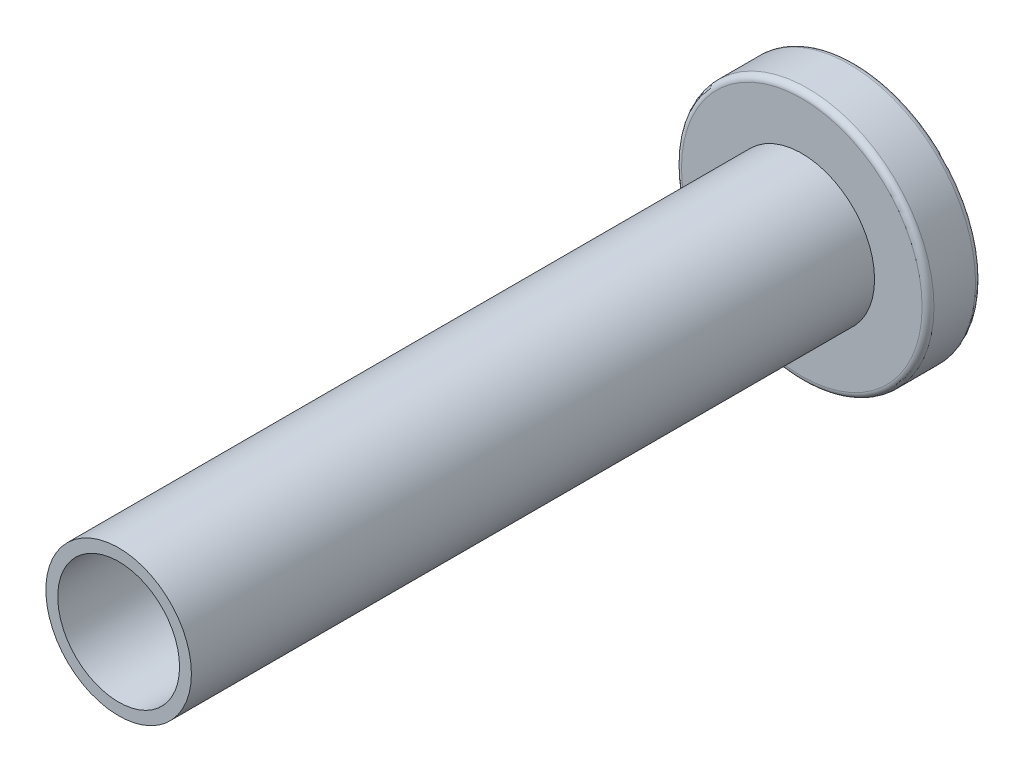
ISO-10303-21;
HEADER;
FILE_DESCRIPTION(('STEP AP214'),'2;1');
FILE_NAME('part.step','',(''),(''),'','','');
FILE_SCHEMA(('AUTOMOTIVE_DESIGN { 1 0 10303 214 1 1 1 1 }'));
ENDSEC;
DATA;
#1=APPLICATION_CONTEXT('core data for automotive mechanical design processes');
#2=APPLICATION_PROTOCOL_DEFINITION('international standard','automotive_design',2000,#1);
#3=PRODUCT_CONTEXT('',#1,'mechanical');
#4=PRODUCT('Part','Part','',(#3));
#5=PRODUCT_RELATED_PRODUCT_CATEGORY('part','',(#4));
#6=PRODUCT_DEFINITION_FORMATION('','',#4);
#7=PRODUCT_DEFINITION_CONTEXT('part definition',#1,'design');
#8=PRODUCT_DEFINITION('design','',#6,#7);
#9=PRODUCT_DEFINITION_SHAPE('','',#8);
#10=(LENGTH_UNIT() NAMED_UNIT(*) SI_UNIT(.MILLI.,.METRE.));
#11=(NAMED_UNIT(*) PLANE_ANGLE_UNIT() SI_UNIT($,.RADIAN.));
#12=(NAMED_UNIT(*) SI_UNIT($,.STERADIAN.) SOLID_ANGLE_UNIT());
#13=UNCERTAINTY_MEASURE_WITH_UNIT(LENGTH_MEASURE(1.E-05),#10,'distance_accuracy_value','');
#14=(GEOMETRIC_REPRESENTATION_CONTEXT(3) GLOBAL_UNCERTAINTY_ASSIGNED_CONTEXT((#13)) GLOBAL_UNIT_ASSIGNED_CONTEXT((#10,
#11,#12)) REPRESENTATION_CONTEXT('',''));
#15=CARTESIAN_POINT('',(0.,0.,0.));
#16=DIRECTION('',(0.,0.,1.));
#17=DIRECTION('',(1.,0.,0.));
#18=AXIS2_PLACEMENT_3D('',#15,#16,#17);
#19=CARTESIAN_POINT('',(0.,0.,1.8));
#20=DIRECTION('',(0.,0.,-1.));
#21=DIRECTION('',(-1.,0.,0.));
#22=AXIS2_PLACEMENT_3D('',#19,#20,#21);
#23=CYLINDRICAL_SURFACE('',#22,4.25);
#24=CARTESIAN_POINT('',(0.,0.,0.2));
#25=DIRECTION('',(0.,0.,1.));
#26=DIRECTION('',(1.,0.,0.));
#27=AXIS2_PLACEMENT_3D('',#24,#25,#26);
#28=CIRCLE('',#27,4.25);
#29=CARTESIAN_POINT('',(4.25,0.,0.2));
#30=VERTEX_POINT('',#29);
#31=EDGE_CURVE('E167',#30,#30,#28,.T.);
#32=ORIENTED_EDGE('',*,*,#31,.T.);
#33=EDGE_LOOP('',(#32));
#34=FACE_BOUND('',#33,.T.);
#35=CARTESIAN_POINT('',(0.,0.,1.6));
#36=DIRECTION('',(0.,0.,1.));
#37=DIRECTION('',(1.,0.,0.));
#38=AXIS2_PLACEMENT_3D('',#35,#36,#37);
#39=CIRCLE('',#38,4.25);
#40=CARTESIAN_POINT('',(4.25,0.,1.6));
#41=VERTEX_POINT('',#40);
#42=EDGE_CURVE('E164',#41,#41,#39,.F.);
#43=ORIENTED_EDGE('',*,*,#42,.T.);
#44=EDGE_LOOP('',(#43));
#45=FACE_BOUND('',#44,.T.);
#46=ADVANCED_FACE('F45',(#34,#45),#23,.T.);
#47=CARTESIAN_POINT('',(0.,0.,1.8));
#48=DIRECTION('',(0.,0.,1.));
#49=DIRECTION('',(1.,0.,0.));
#50=AXIS2_PLACEMENT_3D('',#47,#48,#49);
#51=PLANE('',#50);
#52=CARTESIAN_POINT('',(0.,0.,1.8));
#53=DIRECTION('',(0.,0.,1.));
#54=DIRECTION('',(1.,0.,0.));
#55=AXIS2_PLACEMENT_3D('',#52,#53,#54);
#56=CIRCLE('',#55,4.05);
#57=CARTESIAN_POINT('',(4.05,0.,1.8));
#58=VERTEX_POINT('',#57);
#59=EDGE_CURVE('E11',#58,#58,#56,.T.);
#60=ORIENTED_EDGE('',*,*,#59,.T.);
#61=EDGE_LOOP('',(#60));
#62=FACE_BOUND('',#61,.T.);
#63=CARTESIAN_POINT('',(0.,0.,1.8));
#64=DIRECTION('',(0.,0.,1.));
#65=DIRECTION('',(1.,0.,0.));
#66=AXIS2_PLACEMENT_3D('',#63,#64,#65);
#67=CIRCLE('',#66,2.45);
#68=CARTESIAN_POINT('',(2.45,0.,1.8));
#69=VERTEX_POINT('',#68);
#70=EDGE_CURVE('E155',#69,#69,#67,.T.);
#71=ORIENTED_EDGE('',*,*,#70,.F.);
#72=EDGE_LOOP('',(#71));
#73=FACE_BOUND('',#72,.T.);
#74=ADVANCED_FACE('F182',(#62,#73),#51,.T.);
#75=CARTESIAN_POINT('',(0.,0.,0.));
#76=DIRECTION('',(0.,0.,1.));
#77=DIRECTION('',(1.,0.,0.));
#78=AXIS2_PLACEMENT_3D('',#75,#76,#77);
#79=PLANE('',#78);
#80=DIRECTION('',(0.5,0.866025403784438,0.));
#81=VECTOR('',#80,1.);
#82=CARTESIAN_POINT('',(-1.44337567297407,0.,0.));
#83=LINE('',#82,#81);
#84=CARTESIAN_POINT('',(-1.44337567297407,0.,0.));
#85=VERTEX_POINT('',#84);
#86=CARTESIAN_POINT('',(-0.721687836487032,1.25,0.));
#87=VERTEX_POINT('',#86);
#88=EDGE_CURVE('E134',#85,#87,#83,.T.);
#89=ORIENTED_EDGE('',*,*,#88,.F.);
#90=DIRECTION('',(-0.5,0.866025403784438,0.));
#91=VECTOR('',#90,1.);
#92=CARTESIAN_POINT('',(-0.721687836487033,-1.25,0.));
#93=LINE('',#92,#91);
#94=CARTESIAN_POINT('',(-0.721687836487033,-1.25,0.));
#95=VERTEX_POINT('',#94);
#96=EDGE_CURVE('E60',#95,#85,#93,.T.);
#97=ORIENTED_EDGE('',*,*,#96,.F.);
#98=DIRECTION('',(-1.,0.,0.));
#99=VECTOR('',#98,1.);
#100=CARTESIAN_POINT('',(0.721687836487032,-1.25,0.));
#101=LINE('',#100,#99);
#102=CARTESIAN_POINT('',(0.721687836487032,-1.25,0.));
#103=VERTEX_POINT('',#102);
#104=EDGE_CURVE('E143',#103,#95,#101,.T.);
#105=ORIENTED_EDGE('',*,*,#104,.F.);
#106=DIRECTION('',(-0.5,-0.866025403784438,0.));
#107=VECTOR('',#106,1.);
#108=CARTESIAN_POINT('',(1.44337567297406,0.,0.));
#109=LINE('',#108,#107);
#110=CARTESIAN_POINT('',(1.44337567297406,0.,0.));
#111=VERTEX_POINT('',#110);
#112=EDGE_CURVE('E141',#111,#103,#109,.T.);
#113=ORIENTED_EDGE('',*,*,#112,.F.);
#114=DIRECTION('',(0.5,-0.866025403784438,0.));
#115=VECTOR('',#114,1.);
#116=CARTESIAN_POINT('',(0.721687836487032,1.25,0.));
#117=LINE('',#116,#115);
#118=CARTESIAN_POINT('',(0.721687836487032,1.25,0.));
#119=VERTEX_POINT('',#118);
#120=EDGE_CURVE('E108',#119,#111,#117,.T.);
#121=ORIENTED_EDGE('',*,*,#120,.F.);
#122=DIRECTION('',(1.,0.,0.));
#123=VECTOR('',#122,1.);
#124=CARTESIAN_POINT('',(-0.721687836487032,1.25,0.));
#125=LINE('',#124,#123);
#126=EDGE_CURVE('E137',#87,#119,#125,.T.);
#127=ORIENTED_EDGE('',*,*,#126,.F.);
#128=EDGE_LOOP('',(#89,#97,#105,#113,#121,#127));
#129=FACE_BOUND('',#128,.T.);
#130=CARTESIAN_POINT('',(0.,0.,0.));
#131=DIRECTION('',(0.,0.,1.));
#132=DIRECTION('',(1.,0.,0.));
#133=AXIS2_PLACEMENT_3D('',#130,#131,#132);
#134=CIRCLE('',#133,4.05);
#135=CARTESIAN_POINT('',(4.05,0.,0.));
#136=VERTEX_POINT('',#135);
#137=EDGE_CURVE('E53',#136,#136,#134,.F.);
#138=ORIENTED_EDGE('',*,*,#137,.T.);
#139=EDGE_LOOP('',(#138));
#140=FACE_BOUND('',#139,.T.);
#141=ADVANCED_FACE('F172',(#129,#140),#79,.F.);
#142=CARTESIAN_POINT('',(0.,0.,24.8));
#143=DIRECTION('',(0.,0.,1.));
#144=DIRECTION('',(1.,0.,0.));
#145=AXIS2_PLACEMENT_3D('',#142,#143,#144);
#146=PLANE('',#145);
#147=CARTESIAN_POINT('',(0.,0.,24.8));
#148=DIRECTION('',(0.,0.,1.));
#149=DIRECTION('',(1.,0.,0.));
#150=AXIS2_PLACEMENT_3D('',#147,#148,#149);
#151=CIRCLE('',#150,2.45);
#152=CARTESIAN_POINT('',(2.45,0.,24.8));
#153=VERTEX_POINT('',#152);
#154=EDGE_CURVE('E156',#153,#153,#151,.T.);
#155=ORIENTED_EDGE('',*,*,#154,.T.);
#156=EDGE_LOOP('',(#155));
#157=FACE_BOUND('',#156,.T.);
#158=CARTESIAN_POINT('',(0.,0.,24.8));
#159=DIRECTION('',(0.,0.,1.));
#160=DIRECTION('',(1.,0.,0.));
#161=AXIS2_PLACEMENT_3D('',#158,#159,#160);
#162=CIRCLE('',#161,2.05);
#163=CARTESIAN_POINT('',(2.05,0.,24.8));
#164=VERTEX_POINT('',#163);
#165=EDGE_CURVE('E147',#164,#164,#162,.T.);
#166=ORIENTED_EDGE('',*,*,#165,.F.);
#167=EDGE_LOOP('',(#166));
#168=FACE_BOUND('',#167,.T.);
#169=ADVANCED_FACE('F199',(#157,#168),#146,.T.);
#170=CARTESIAN_POINT('',(0.,0.,24.8));
#171=DIRECTION('',(0.,0.,-1.));
#172=DIRECTION('',(-1.,0.,0.));
#173=AXIS2_PLACEMENT_3D('',#170,#171,#172);
#174=CYLINDRICAL_SURFACE('',#173,2.45);
#175=ORIENTED_EDGE('',*,*,#154,.F.);
#176=EDGE_LOOP('',(#175));
#177=FACE_BOUND('',#176,.T.);
#178=ORIENTED_EDGE('',*,*,#70,.T.);
#179=EDGE_LOOP('',(#178));
#180=FACE_BOUND('',#179,.T.);
#181=ADVANCED_FACE('F196',(#177,#180),#174,.T.);
#182=CARTESIAN_POINT('',(0.,0.,24.8));
#183=DIRECTION('',(0.,0.,-1.));
#184=DIRECTION('',(-1.,0.,0.));
#185=AXIS2_PLACEMENT_3D('',#182,#183,#184);
#186=CYLINDRICAL_SURFACE('',#185,2.05);
#187=ORIENTED_EDGE('',*,*,#165,.T.);
#188=EDGE_LOOP('',(#187));
#189=FACE_BOUND('',#188,.T.);
#190=CARTESIAN_POINT('',(0.,0.,1.8));
#191=DIRECTION('',(0.,0.,1.));
#192=DIRECTION('',(1.,0.,0.));
#193=AXIS2_PLACEMENT_3D('',#190,#191,#192);
#194=CIRCLE('',#193,2.05);
#195=CARTESIAN_POINT('',(2.05,0.,1.8));
#196=VERTEX_POINT('',#195);
#197=EDGE_CURVE('E159',#196,#196,#194,.F.);
#198=ORIENTED_EDGE('',*,*,#197,.T.);
#199=EDGE_LOOP('',(#198));
#200=FACE_BOUND('',#199,.T.);
#201=ADVANCED_FACE('F198',(#189,#200),#186,.F.);
#202=ORIENTED_EDGE('',*,*,#197,.F.);
#203=EDGE_LOOP('',(#202));
#204=FACE_BOUND('',#203,.T.);
#205=ADVANCED_FACE('F177',(#204),#51,.T.);
#206=CARTESIAN_POINT('',(0.,0.,0.2));
#207=DIRECTION('',(0.,0.,1.));
#208=DIRECTION('',(1.,0.,0.));
#209=AXIS2_PLACEMENT_3D('',#206,#207,#208);
#210=TOROIDAL_SURFACE('',#209,4.05,0.2);
#211=ORIENTED_EDGE('',*,*,#137,.F.);
#212=EDGE_LOOP('',(#211));
#213=FACE_BOUND('',#212,.T.);
#214=ORIENTED_EDGE('',*,*,#31,.F.);
#215=EDGE_LOOP('',(#214));
#216=FACE_BOUND('',#215,.T.);
#217=ADVANCED_FACE('F174',(#213,#216),#210,.T.);
#218=CARTESIAN_POINT('',(0.,0.,1.6));
#219=DIRECTION('',(0.,0.,1.));
#220=DIRECTION('',(1.,0.,0.));
#221=AXIS2_PLACEMENT_3D('',#218,#219,#220);
#222=TOROIDAL_SURFACE('',#221,4.05,0.2);
#223=ORIENTED_EDGE('',*,*,#42,.F.);
#224=EDGE_LOOP('',(#223));
#225=FACE_BOUND('',#224,.T.);
#226=ORIENTED_EDGE('',*,*,#59,.F.);
#227=EDGE_LOOP('',(#226));
#228=FACE_BOUND('',#227,.T.);
#229=ADVANCED_FACE('F47',(#225,#228),#222,.T.);
#230=CARTESIAN_POINT('',(-0.721687836487033,-1.25,1.));
#231=DIRECTION('',(-0.866025403784439,-0.5,0.));
#232=DIRECTION('',(0.5,-0.866025403784439,0.));
#233=AXIS2_PLACEMENT_3D('',#230,#231,#232);
#234=PLANE('',#233);
#235=ORIENTED_EDGE('',*,*,#96,.T.);
#236=DIRECTION('',(0.,0.,-1.));
#237=VECTOR('',#236,1.);
#238=CARTESIAN_POINT('',(-1.44337567297407,0.,1.));
#239=LINE('',#238,#237);
#240=CARTESIAN_POINT('',(-1.44337567297407,0.,1.));
#241=VERTEX_POINT('',#240);
#242=EDGE_CURVE('E90',#241,#85,#239,.T.);
#243=ORIENTED_EDGE('',*,*,#242,.F.);
#244=DIRECTION('',(-0.5,0.866025403784438,0.));
#245=VECTOR('',#244,1.);
#246=CARTESIAN_POINT('',(-0.721687836487033,-1.25,1.));
#247=LINE('',#246,#245);
#248=CARTESIAN_POINT('',(-0.721687836487033,-1.25,1.));
#249=VERTEX_POINT('',#248);
#250=EDGE_CURVE('E145',#249,#241,#247,.T.);
#251=ORIENTED_EDGE('',*,*,#250,.F.);
#252=DIRECTION('',(0.,0.,-1.));
#253=VECTOR('',#252,1.);
#254=CARTESIAN_POINT('',(-0.721687836487033,-1.25,1.));
#255=LINE('',#254,#253);
#256=EDGE_CURVE('E68',#249,#95,#255,.T.);
#257=ORIENTED_EDGE('',*,*,#256,.T.);
#258=EDGE_LOOP('',(#235,#243,#251,#257));
#259=FACE_BOUND('',#258,.T.);
#260=ADVANCED_FACE('F188',(#259),#234,.F.);
#261=CARTESIAN_POINT('',(0.721687836487032,-1.25,1.));
#262=DIRECTION('',(0.,-1.,0.));
#263=DIRECTION('',(1.,0.,0.));
#264=AXIS2_PLACEMENT_3D('',#261,#262,#263);
#265=PLANE('',#264);
#266=ORIENTED_EDGE('',*,*,#104,.T.);
#267=ORIENTED_EDGE('',*,*,#256,.F.);
#268=DIRECTION('',(-1.,0.,0.));
#269=VECTOR('',#268,1.);
#270=CARTESIAN_POINT('',(0.721687836487032,-1.25,1.));
#271=LINE('',#270,#269);
#272=CARTESIAN_POINT('',(0.721687836487032,-1.25,1.));
#273=VERTEX_POINT('',#272);
#274=EDGE_CURVE('E120',#273,#249,#271,.T.);
#275=ORIENTED_EDGE('',*,*,#274,.F.);
#276=DIRECTION('',(0.,0.,-1.));
#277=VECTOR('',#276,1.);
#278=CARTESIAN_POINT('',(0.721687836487032,-1.25,1.));
#279=LINE('',#278,#277);
#280=EDGE_CURVE('E112',#273,#103,#279,.T.);
#281=ORIENTED_EDGE('',*,*,#280,.T.);
#282=EDGE_LOOP('',(#266,#267,#275,#281));
#283=FACE_BOUND('',#282,.T.);
#284=ADVANCED_FACE('F223',(#283),#265,.F.);
#285=CARTESIAN_POINT('',(1.44337567297406,0.,1.));
#286=DIRECTION('',(0.866025403784438,-0.5,0.));
#287=DIRECTION('',(0.5,0.866025403784439,0.));
#288=AXIS2_PLACEMENT_3D('',#285,#286,#287);
#289=PLANE('',#288);
#290=ORIENTED_EDGE('',*,*,#112,.T.);
#291=ORIENTED_EDGE('',*,*,#280,.F.);
#292=DIRECTION('',(-0.5,-0.866025403784438,0.));
#293=VECTOR('',#292,1.);
#294=CARTESIAN_POINT('',(1.44337567297406,0.,1.));
#295=LINE('',#294,#293);
#296=CARTESIAN_POINT('',(1.44337567297406,0.,1.));
#297=VERTEX_POINT('',#296);
#298=EDGE_CURVE('E116',#297,#273,#295,.T.);
#299=ORIENTED_EDGE('',*,*,#298,.F.);
#300=DIRECTION('',(0.,0.,-1.));
#301=VECTOR('',#300,1.);
#302=CARTESIAN_POINT('',(1.44337567297406,0.,1.));
#303=LINE('',#302,#301);
#304=EDGE_CURVE('E101',#297,#111,#303,.T.);
#305=ORIENTED_EDGE('',*,*,#304,.T.);
#306=EDGE_LOOP('',(#290,#291,#299,#305));
#307=FACE_BOUND('',#306,.T.);
#308=ADVANCED_FACE('F117',(#307),#289,.F.);
#309=CARTESIAN_POINT('',(0.721687836487032,1.25,1.));
#310=DIRECTION('',(0.866025403784439,0.5,0.));
#311=DIRECTION('',(-0.5,0.866025403784438,0.));
#312=AXIS2_PLACEMENT_3D('',#309,#310,#311);
#313=PLANE('',#312);
#314=ORIENTED_EDGE('',*,*,#120,.T.);
#315=ORIENTED_EDGE('',*,*,#304,.F.);
#316=DIRECTION('',(0.5,-0.866025403784438,0.));
#317=VECTOR('',#316,1.);
#318=CARTESIAN_POINT('',(0.721687836487032,1.25,1.));
#319=LINE('',#318,#317);
#320=CARTESIAN_POINT('',(0.721687836487032,1.25,1.));
#321=VERTEX_POINT('',#320);
#322=EDGE_CURVE('E105',#321,#297,#319,.T.);
#323=ORIENTED_EDGE('',*,*,#322,.F.);
#324=DIRECTION('',(0.,0.,-1.));
#325=VECTOR('',#324,1.);
#326=CARTESIAN_POINT('',(0.721687836487032,1.25,1.));
#327=LINE('',#326,#325);
#328=EDGE_CURVE('E113',#321,#119,#327,.T.);
#329=ORIENTED_EDGE('',*,*,#328,.T.);
#330=EDGE_LOOP('',(#314,#315,#323,#329));
#331=FACE_BOUND('',#330,.T.);
#332=ADVANCED_FACE('F103',(#331),#313,.F.);
#333=CARTESIAN_POINT('',(-0.721687836487032,1.25,1.));
#334=DIRECTION('',(0.,1.,0.));
#335=DIRECTION('',(0.,0.,1.));
#336=AXIS2_PLACEMENT_3D('',#333,#334,#335);
#337=PLANE('',#336);
#338=ORIENTED_EDGE('',*,*,#126,.T.);
#339=ORIENTED_EDGE('',*,*,#328,.F.);
#340=DIRECTION('',(1.,0.,0.));
#341=VECTOR('',#340,1.);
#342=CARTESIAN_POINT('',(-0.721687836487032,1.25,1.));
#343=LINE('',#342,#341);
#344=CARTESIAN_POINT('',(-0.721687836487032,1.25,1.));
#345=VERTEX_POINT('',#344);
#346=EDGE_CURVE('E126',#345,#321,#343,.T.);
#347=ORIENTED_EDGE('',*,*,#346,.F.);
#348=DIRECTION('',(0.,0.,-1.));
#349=VECTOR('',#348,1.);
#350=CARTESIAN_POINT('',(-0.721687836487032,1.25,1.));
#351=LINE('',#350,#349);
#352=EDGE_CURVE('E150',#345,#87,#351,.T.);
#353=ORIENTED_EDGE('',*,*,#352,.T.);
#354=EDGE_LOOP('',(#338,#339,#347,#353));
#355=FACE_BOUND('',#354,.T.);
#356=ADVANCED_FACE('F232',(#355),#337,.F.);
#357=CARTESIAN_POINT('',(-1.44337567297407,0.,1.));
#358=DIRECTION('',(-0.866025403784439,0.5,0.));
#359=DIRECTION('',(-0.5,-0.866025403784438,0.));
#360=AXIS2_PLACEMENT_3D('',#357,#358,#359);
#361=PLANE('',#360);
#362=ORIENTED_EDGE('',*,*,#88,.T.);
#363=ORIENTED_EDGE('',*,*,#352,.F.);
#364=DIRECTION('',(0.5,0.866025403784438,0.));
#365=VECTOR('',#364,1.);
#366=CARTESIAN_POINT('',(-1.44337567297407,0.,1.));
#367=LINE('',#366,#365);
#368=EDGE_CURVE('E128',#241,#345,#367,.T.);
#369=ORIENTED_EDGE('',*,*,#368,.F.);
#370=ORIENTED_EDGE('',*,*,#242,.T.);
#371=EDGE_LOOP('',(#362,#363,#369,#370));
#372=FACE_BOUND('',#371,.T.);
#373=ADVANCED_FACE('F220',(#372),#361,.F.);
#374=CARTESIAN_POINT('',(0.,0.,1.));
#375=DIRECTION('',(0.,0.,-1.));
#376=DIRECTION('',(-1.,0.,0.));
#377=AXIS2_PLACEMENT_3D('',#374,#375,#376);
#378=PLANE('',#377);
#379=ORIENTED_EDGE('',*,*,#250,.T.);
#380=ORIENTED_EDGE('',*,*,#368,.T.);
#381=ORIENTED_EDGE('',*,*,#346,.T.);
#382=ORIENTED_EDGE('',*,*,#322,.T.);
#383=ORIENTED_EDGE('',*,*,#298,.T.);
#384=ORIENTED_EDGE('',*,*,#274,.T.);
#385=EDGE_LOOP('',(#379,#380,#381,#382,#383,#384));
#386=FACE_BOUND('',#385,.T.);
#387=ADVANCED_FACE('F123',(#386),#378,.T.);
#388=CLOSED_SHELL('',(#46,#74,#141,#169,#181,#201,#205,#217,#229,#260,#284,#308,#332,#356,#373,#387));
#389=MANIFOLD_SOLID_BREP('B2',#388);
#390=ADVANCED_BREP_SHAPE_REPRESENTATION('',(#18,#389),#14);
#391=SHAPE_DEFINITION_REPRESENTATION(#9,#390);
ENDSEC;
END-ISO-10303-21;
